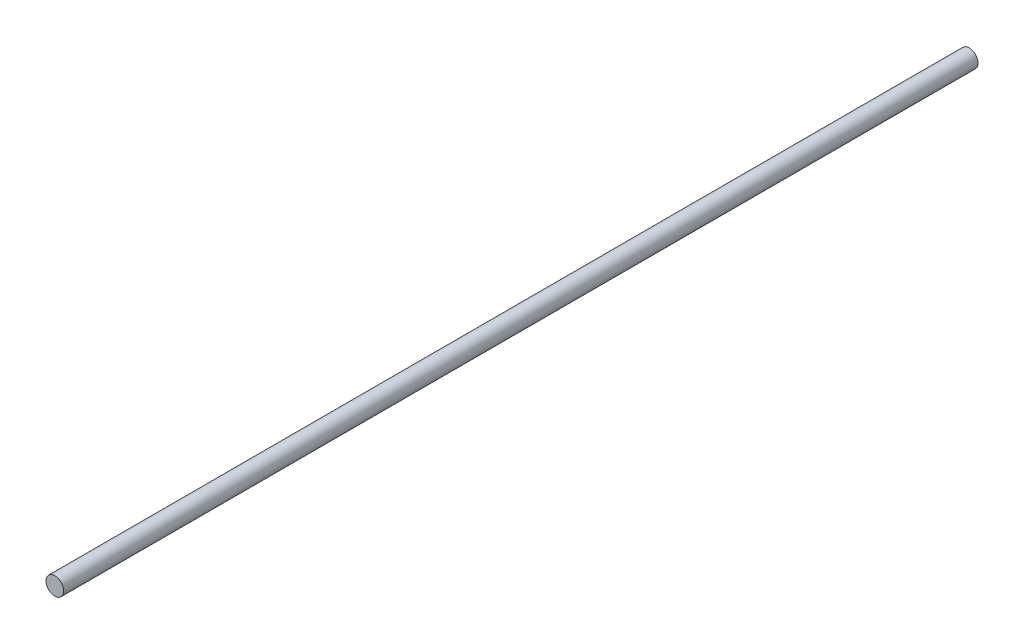
ISO-10303-21;
HEADER;
FILE_DESCRIPTION(('STEP AP214'),'2;1');
FILE_NAME('part.step','',(''),(''),'','','');
FILE_SCHEMA(('AUTOMOTIVE_DESIGN { 1 0 10303 214 1 1 1 1 }'));
ENDSEC;
DATA;
#1=APPLICATION_CONTEXT('core data for automotive mechanical design processes');
#2=APPLICATION_PROTOCOL_DEFINITION('international standard','automotive_design',2000,#1);
#3=PRODUCT_CONTEXT('',#1,'mechanical');
#4=PRODUCT('Part','Part','',(#3));
#5=PRODUCT_RELATED_PRODUCT_CATEGORY('part','',(#4));
#6=PRODUCT_DEFINITION_FORMATION('','',#4);
#7=PRODUCT_DEFINITION_CONTEXT('part definition',#1,'design');
#8=PRODUCT_DEFINITION('design','',#6,#7);
#9=PRODUCT_DEFINITION_SHAPE('','',#8);
#10=(LENGTH_UNIT() NAMED_UNIT(*) SI_UNIT(.MILLI.,.METRE.));
#11=(NAMED_UNIT(*) PLANE_ANGLE_UNIT() SI_UNIT($,.RADIAN.));
#12=(NAMED_UNIT(*) SI_UNIT($,.STERADIAN.) SOLID_ANGLE_UNIT());
#13=UNCERTAINTY_MEASURE_WITH_UNIT(LENGTH_MEASURE(1.E-05),#10,'distance_accuracy_value','');
#14=(GEOMETRIC_REPRESENTATION_CONTEXT(3) GLOBAL_UNCERTAINTY_ASSIGNED_CONTEXT((#13)) GLOBAL_UNIT_ASSIGNED_CONTEXT((#10,
#11,#12)) REPRESENTATION_CONTEXT('',''));
#15=CARTESIAN_POINT('',(0.,0.,0.));
#16=DIRECTION('',(0.,0.,1.));
#17=DIRECTION('',(1.,0.,0.));
#18=AXIS2_PLACEMENT_3D('',#15,#16,#17);
#19=CARTESIAN_POINT('',(0.,0.,77.675));
#20=DIRECTION('',(0.,0.,-1.));
#21=DIRECTION('',(-1.,0.,0.));
#22=AXIS2_PLACEMENT_3D('',#19,#20,#21);
#23=CYLINDRICAL_SURFACE('',#22,1.5);
#24=CARTESIAN_POINT('',(0.,0.,77.675));
#25=DIRECTION('',(0.,0.,1.));
#26=DIRECTION('',(1.,0.,0.));
#27=AXIS2_PLACEMENT_3D('',#24,#25,#26);
#28=CIRCLE('',#27,1.5);
#29=CARTESIAN_POINT('',(1.5,0.,77.675));
#30=VERTEX_POINT('',#29);
#31=EDGE_CURVE('E10',#30,#30,#28,.T.);
#32=ORIENTED_EDGE('',*,*,#31,.F.);
#33=EDGE_LOOP('',(#32));
#34=FACE_BOUND('',#33,.T.);
#35=CARTESIAN_POINT('',(0.,0.,-77.675));
#36=DIRECTION('',(0.,0.,1.));
#37=DIRECTION('',(1.,0.,0.));
#38=AXIS2_PLACEMENT_3D('',#35,#36,#37);
#39=CIRCLE('',#38,1.5);
#40=CARTESIAN_POINT('',(1.5,0.,-77.675));
#41=VERTEX_POINT('',#40);
#42=EDGE_CURVE('E38',#41,#41,#39,.T.);
#43=ORIENTED_EDGE('',*,*,#42,.T.);
#44=EDGE_LOOP('',(#43));
#45=FACE_BOUND('',#44,.T.);
#46=ADVANCED_FACE('F35',(#34,#45),#23,.T.);
#47=CARTESIAN_POINT('',(0.,0.,77.675));
#48=DIRECTION('',(0.,0.,1.));
#49=DIRECTION('',(1.,0.,0.));
#50=AXIS2_PLACEMENT_3D('',#47,#48,#49);
#51=PLANE('',#50);
#52=ORIENTED_EDGE('',*,*,#31,.T.);
#53=EDGE_LOOP('',(#52));
#54=FACE_BOUND('',#53,.T.);
#55=ADVANCED_FACE('F50',(#54),#51,.T.);
#56=CARTESIAN_POINT('',(0.,0.,-77.675));
#57=DIRECTION('',(0.,0.,1.));
#58=DIRECTION('',(1.,0.,0.));
#59=AXIS2_PLACEMENT_3D('',#56,#57,#58);
#60=PLANE('',#59);
#61=ORIENTED_EDGE('',*,*,#42,.F.);
#62=EDGE_LOOP('',(#61));
#63=FACE_BOUND('',#62,.T.);
#64=ADVANCED_FACE('F48',(#63),#60,.F.);
#65=CLOSED_SHELL('',(#46,#55,#64));
#66=MANIFOLD_SOLID_BREP('B2',#65);
#67=ADVANCED_BREP_SHAPE_REPRESENTATION('',(#18,#66),#14);
#68=SHAPE_DEFINITION_REPRESENTATION(#9,#67);
ENDSEC;
END-ISO-10303-21;
